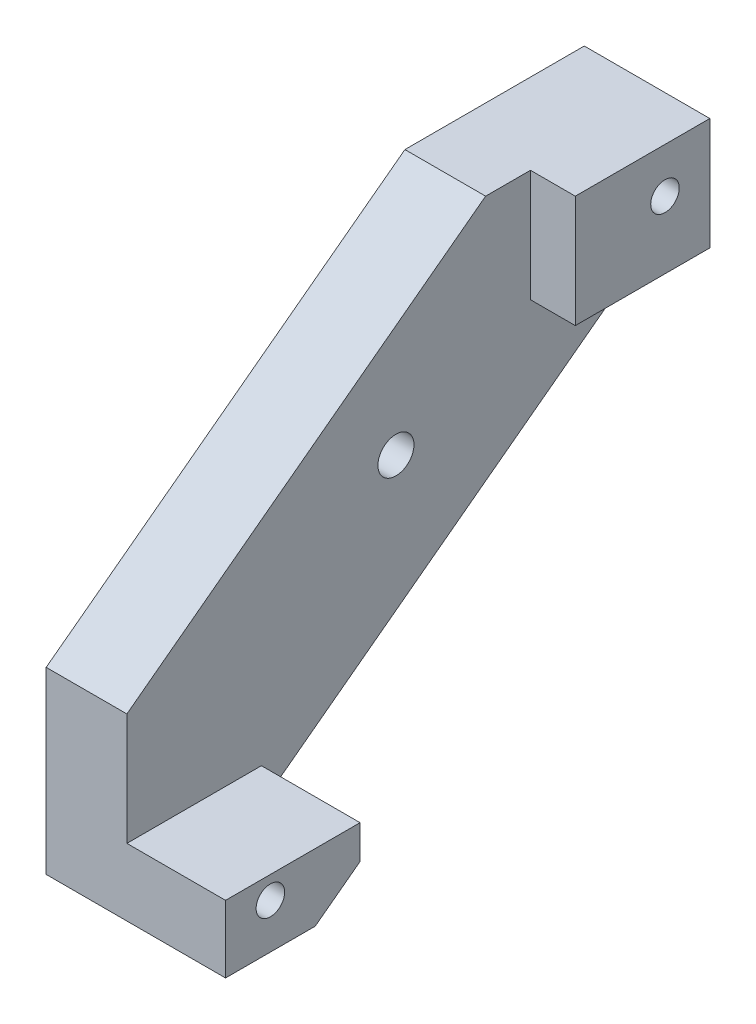
ISO-10303-21;
HEADER;
FILE_DESCRIPTION(('STEP AP214'),'2;1');
FILE_NAME('part.step','',(''),(''),'','','');
FILE_SCHEMA(('AUTOMOTIVE_DESIGN { 1 0 10303 214 1 1 1 1 }'));
ENDSEC;
DATA;
#1=APPLICATION_CONTEXT('core data for automotive mechanical design processes');
#2=APPLICATION_PROTOCOL_DEFINITION('international standard','automotive_design',2000,#1);
#3=PRODUCT_CONTEXT('',#1,'mechanical');
#4=PRODUCT('Part','Part','',(#3));
#5=PRODUCT_RELATED_PRODUCT_CATEGORY('part','',(#4));
#6=PRODUCT_DEFINITION_FORMATION('','',#4);
#7=PRODUCT_DEFINITION_CONTEXT('part definition',#1,'design');
#8=PRODUCT_DEFINITION('design','',#6,#7);
#9=PRODUCT_DEFINITION_SHAPE('','',#8);
#10=(LENGTH_UNIT() NAMED_UNIT(*) SI_UNIT(.MILLI.,.METRE.));
#11=(NAMED_UNIT(*) PLANE_ANGLE_UNIT() SI_UNIT($,.RADIAN.));
#12=(NAMED_UNIT(*) SI_UNIT($,.STERADIAN.) SOLID_ANGLE_UNIT());
#13=UNCERTAINTY_MEASURE_WITH_UNIT(LENGTH_MEASURE(1.E-05),#10,'distance_accuracy_value','');
#14=(GEOMETRIC_REPRESENTATION_CONTEXT(3) GLOBAL_UNCERTAINTY_ASSIGNED_CONTEXT((#13)) GLOBAL_UNIT_ASSIGNED_CONTEXT((#10,
#11,#12)) REPRESENTATION_CONTEXT('',''));
#15=CARTESIAN_POINT('',(0.,0.,0.));
#16=DIRECTION('',(0.,0.,1.));
#17=DIRECTION('',(1.,0.,0.));
#18=AXIS2_PLACEMENT_3D('',#15,#16,#17);
#19=CARTESIAN_POINT('',(25.4,0.,0.));
#20=DIRECTION('',(-1.,0.,0.));
#21=DIRECTION('',(0.,0.,1.));
#22=AXIS2_PLACEMENT_3D('',#19,#20,#21);
#23=PLANE('',#22);
#24=CARTESIAN_POINT('',(25.4,-25.4,31.75));
#25=DIRECTION('',(1.,0.,0.));
#26=DIRECTION('',(0.,0.,-1.));
#27=AXIS2_PLACEMENT_3D('',#24,#25,#26);
#28=CIRCLE('',#27,2.0193);
#29=CARTESIAN_POINT('',(25.4,-25.4,29.7307));
#30=VERTEX_POINT('',#29);
#31=EDGE_CURVE('E163',#30,#30,#28,.T.);
#32=ORIENTED_EDGE('',*,*,#31,.F.);
#33=EDGE_LOOP('',(#32));
#34=FACE_BOUND('',#33,.T.);
#35=DIRECTION('',(0.,-0.6,0.8));
#36=VECTOR('',#35,1.);
#37=CARTESIAN_POINT('',(25.4,15.875,-38.1));
#38=LINE('',#37,#36);
#39=CARTESIAN_POINT('',(25.4,-26.9875,19.05));
#40=VERTEX_POINT('',#39);
#41=CARTESIAN_POINT('',(25.4,-31.75,25.4));
#42=VERTEX_POINT('',#41);
#43=EDGE_CURVE('E236',#40,#42,#38,.T.);
#44=ORIENTED_EDGE('',*,*,#43,.F.);
#45=DIRECTION('',(0.,-1.,0.));
#46=VECTOR('',#45,1.);
#47=CARTESIAN_POINT('',(25.4,-31.75,19.05));
#48=LINE('',#47,#46);
#49=CARTESIAN_POINT('',(25.4,-22.225,19.05));
#50=VERTEX_POINT('',#49);
#51=EDGE_CURVE('E178',#50,#40,#48,.T.);
#52=ORIENTED_EDGE('',*,*,#51,.F.);
#53=DIRECTION('',(0.,0.,-1.));
#54=VECTOR('',#53,1.);
#55=CARTESIAN_POINT('',(25.4,-22.225,38.1));
#56=LINE('',#55,#54);
#57=CARTESIAN_POINT('',(25.4,-22.225,38.1));
#58=VERTEX_POINT('',#57);
#59=EDGE_CURVE('E152',#58,#50,#56,.T.);
#60=ORIENTED_EDGE('',*,*,#59,.F.);
#61=DIRECTION('',(0.,-1.,0.));
#62=VECTOR('',#61,1.);
#63=CARTESIAN_POINT('',(25.4,-31.75,38.1));
#64=LINE('',#63,#62);
#65=CARTESIAN_POINT('',(25.4,-31.75,38.1));
#66=VERTEX_POINT('',#65);
#67=EDGE_CURVE('E193',#58,#66,#64,.T.);
#68=ORIENTED_EDGE('',*,*,#67,.T.);
#69=DIRECTION('',(0.,0.,-1.));
#70=VECTOR('',#69,1.);
#71=CARTESIAN_POINT('',(25.4,-31.75,38.1));
#72=LINE('',#71,#70);
#73=EDGE_CURVE('E195',#66,#42,#72,.T.);
#74=ORIENTED_EDGE('',*,*,#73,.T.);
#75=EDGE_LOOP('',(#44,#52,#60,#68,#74));
#76=FACE_BOUND('',#75,.T.);
#77=ADVANCED_FACE('F39',(#34,#76),#23,.F.);
#78=CARTESIAN_POINT('',(11.43,-31.75,19.05));
#79=DIRECTION('',(0.,0.,1.));
#80=DIRECTION('',(1.,0.,0.));
#81=AXIS2_PLACEMENT_3D('',#78,#79,#80);
#82=PLANE('',#81);
#83=DIRECTION('',(1.,0.,0.));
#84=VECTOR('',#83,1.);
#85=CARTESIAN_POINT('',(11.43,-26.9875,19.05));
#86=LINE('',#85,#84);
#87=CARTESIAN_POINT('',(11.43,-26.9875,19.05));
#88=VERTEX_POINT('',#87);
#89=EDGE_CURVE('E246',#88,#40,#86,.T.);
#90=ORIENTED_EDGE('',*,*,#89,.F.);
#91=DIRECTION('',(0.,-1.,0.));
#92=VECTOR('',#91,1.);
#93=CARTESIAN_POINT('',(11.43,-31.75,19.05));
#94=LINE('',#93,#92);
#95=CARTESIAN_POINT('',(11.43,-22.225,19.05));
#96=VERTEX_POINT('',#95);
#97=EDGE_CURVE('E184',#96,#88,#94,.T.);
#98=ORIENTED_EDGE('',*,*,#97,.F.);
#99=DIRECTION('',(1.,0.,0.));
#100=VECTOR('',#99,1.);
#101=CARTESIAN_POINT('',(11.43,-22.225,19.05));
#102=LINE('',#101,#100);
#103=EDGE_CURVE('E160',#96,#50,#102,.T.);
#104=ORIENTED_EDGE('',*,*,#103,.T.);
#105=ORIENTED_EDGE('',*,*,#51,.T.);
#106=EDGE_LOOP('',(#90,#98,#104,#105));
#107=FACE_BOUND('',#106,.T.);
#108=ADVANCED_FACE('F265',(#107),#82,.F.);
#109=CARTESIAN_POINT('',(25.4,-31.75,-38.1));
#110=DIRECTION('',(0.,0.,1.));
#111=DIRECTION('',(1.,0.,0.));
#112=AXIS2_PLACEMENT_3D('',#109,#110,#111);
#113=PLANE('',#112);
#114=DIRECTION('',(-1.,0.,0.));
#115=VECTOR('',#114,1.);
#116=CARTESIAN_POINT('',(25.4,31.75,-38.1));
#117=LINE('',#116,#115);
#118=CARTESIAN_POINT('',(17.78,31.75,-38.1));
#119=VERTEX_POINT('',#118);
#120=CARTESIAN_POINT('',(0.,31.75,-38.1));
#121=VERTEX_POINT('',#120);
#122=EDGE_CURVE('E140',#119,#121,#117,.T.);
#123=ORIENTED_EDGE('',*,*,#122,.F.);
#124=DIRECTION('',(0.,1.,0.));
#125=VECTOR('',#124,1.);
#126=CARTESIAN_POINT('',(17.78,31.75,-38.1));
#127=LINE('',#126,#125);
#128=CARTESIAN_POINT('',(17.78,15.875,-38.1));
#129=VERTEX_POINT('',#128);
#130=EDGE_CURVE('E129',#129,#119,#127,.T.);
#131=ORIENTED_EDGE('',*,*,#130,.F.);
#132=DIRECTION('',(1.,0.,0.));
#133=VECTOR('',#132,1.);
#134=CARTESIAN_POINT('',(-73.764189942742,15.875,-38.1));
#135=LINE('',#134,#133);
#136=CARTESIAN_POINT('',(11.43,15.875,-38.1));
#137=VERTEX_POINT('',#136);
#138=EDGE_CURVE('E138',#137,#129,#135,.T.);
#139=ORIENTED_EDGE('',*,*,#138,.F.);
#140=DIRECTION('',(-1.,0.,0.));
#141=VECTOR('',#140,1.);
#142=CARTESIAN_POINT('',(25.4,15.875,-38.1));
#143=LINE('',#142,#141);
#144=CARTESIAN_POINT('',(0.,15.875,-38.1));
#145=VERTEX_POINT('',#144);
#146=EDGE_CURVE('E238',#137,#145,#143,.T.);
#147=ORIENTED_EDGE('',*,*,#146,.T.);
#148=DIRECTION('',(0.,1.,0.));
#149=VECTOR('',#148,1.);
#150=CARTESIAN_POINT('',(0.,-31.75,-38.1));
#151=LINE('',#150,#149);
#152=EDGE_CURVE('E192',#145,#121,#151,.T.);
#153=ORIENTED_EDGE('',*,*,#152,.T.);
#154=EDGE_LOOP('',(#123,#131,#139,#147,#153));
#155=FACE_BOUND('',#154,.T.);
#156=ADVANCED_FACE('F41',(#155),#113,.F.);
#157=CARTESIAN_POINT('',(25.4,31.75,38.1));
#158=DIRECTION('',(0.,-1.,0.));
#159=DIRECTION('',(0.,0.,-1.));
#160=AXIS2_PLACEMENT_3D('',#157,#158,#159);
#161=PLANE('',#160);
#162=DIRECTION('',(1.,0.,0.));
#163=VECTOR('',#162,1.);
#164=CARTESIAN_POINT('',(11.43,31.75,-19.05));
#165=LINE('',#164,#163);
#166=CARTESIAN_POINT('',(11.43,31.75,-19.05));
#167=VERTEX_POINT('',#166);
#168=CARTESIAN_POINT('',(17.78,31.75,-19.05));
#169=VERTEX_POINT('',#168);
#170=EDGE_CURVE('E187',#167,#169,#165,.T.);
#171=ORIENTED_EDGE('',*,*,#170,.T.);
#172=DIRECTION('',(0.,0.,-1.));
#173=VECTOR('',#172,1.);
#174=CARTESIAN_POINT('',(17.78,31.75,38.1));
#175=LINE('',#174,#173);
#176=EDGE_CURVE('E141',#169,#119,#175,.T.);
#177=ORIENTED_EDGE('',*,*,#176,.T.);
#178=ORIENTED_EDGE('',*,*,#122,.T.);
#179=DIRECTION('',(0.,0.,1.));
#180=VECTOR('',#179,1.);
#181=CARTESIAN_POINT('',(0.,31.75,38.1));
#182=LINE('',#181,#180);
#183=CARTESIAN_POINT('',(0.,31.75,-12.7));
#184=VERTEX_POINT('',#183);
#185=EDGE_CURVE('E201',#121,#184,#182,.T.);
#186=ORIENTED_EDGE('',*,*,#185,.T.);
#187=DIRECTION('',(-1.,0.,0.));
#188=VECTOR('',#187,1.);
#189=CARTESIAN_POINT('',(25.4,31.75,-12.7));
#190=LINE('',#189,#188);
#191=CARTESIAN_POINT('',(11.43,31.75,-12.7));
#192=VERTEX_POINT('',#191);
#193=EDGE_CURVE('E212',#192,#184,#190,.T.);
#194=ORIENTED_EDGE('',*,*,#193,.F.);
#195=DIRECTION('',(0.,0.,1.));
#196=VECTOR('',#195,1.);
#197=CARTESIAN_POINT('',(11.43,31.75,19.05));
#198=LINE('',#197,#196);
#199=EDGE_CURVE('E181',#167,#192,#198,.T.);
#200=ORIENTED_EDGE('',*,*,#199,.F.);
#201=EDGE_LOOP('',(#171,#177,#178,#186,#194,#200));
#202=FACE_BOUND('',#201,.T.);
#203=ADVANCED_FACE('F218',(#202),#161,.F.);
#204=CARTESIAN_POINT('',(25.4,-31.75,38.1));
#205=DIRECTION('',(0.,0.,-1.));
#206=DIRECTION('',(-1.,0.,0.));
#207=AXIS2_PLACEMENT_3D('',#204,#205,#206);
#208=PLANE('',#207);
#209=DIRECTION('',(1.,0.,0.));
#210=VECTOR('',#209,1.);
#211=CARTESIAN_POINT('',(25.4,-6.34999999999999,38.1));
#212=LINE('',#211,#210);
#213=CARTESIAN_POINT('',(0.,-6.34999999999999,38.1));
#214=VERTEX_POINT('',#213);
#215=CARTESIAN_POINT('',(11.43,-6.34999999999999,38.1));
#216=VERTEX_POINT('',#215);
#217=EDGE_CURVE('E61',#214,#216,#212,.T.);
#218=ORIENTED_EDGE('',*,*,#217,.F.);
#219=DIRECTION('',(0.,-1.,0.));
#220=VECTOR('',#219,1.);
#221=CARTESIAN_POINT('',(0.,-31.75,38.1));
#222=LINE('',#221,#220);
#223=CARTESIAN_POINT('',(0.,-31.75,38.1));
#224=VERTEX_POINT('',#223);
#225=EDGE_CURVE('E204',#214,#224,#222,.T.);
#226=ORIENTED_EDGE('',*,*,#225,.T.);
#227=DIRECTION('',(-1.,0.,0.));
#228=VECTOR('',#227,1.);
#229=CARTESIAN_POINT('',(25.4,-31.75,38.1));
#230=LINE('',#229,#228);
#231=EDGE_CURVE('E199',#66,#224,#230,.T.);
#232=ORIENTED_EDGE('',*,*,#231,.F.);
#233=ORIENTED_EDGE('',*,*,#67,.F.);
#234=DIRECTION('',(1.,0.,0.));
#235=VECTOR('',#234,1.);
#236=CARTESIAN_POINT('',(-73.764189942742,-22.225,38.1));
#237=LINE('',#236,#235);
#238=CARTESIAN_POINT('',(11.43,-22.225,38.1));
#239=VERTEX_POINT('',#238);
#240=EDGE_CURVE('E156',#239,#58,#237,.T.);
#241=ORIENTED_EDGE('',*,*,#240,.F.);
#242=DIRECTION('',(0.,-1.,0.));
#243=VECTOR('',#242,1.);
#244=CARTESIAN_POINT('',(11.43,15.875,38.1));
#245=LINE('',#244,#243);
#246=EDGE_CURVE('E149',#216,#239,#245,.T.);
#247=ORIENTED_EDGE('',*,*,#246,.F.);
#248=EDGE_LOOP('',(#218,#226,#232,#233,#241,#247));
#249=FACE_BOUND('',#248,.T.);
#250=ADVANCED_FACE('F257',(#249),#208,.F.);
#251=CARTESIAN_POINT('',(25.4,-31.75,38.1));
#252=DIRECTION('',(0.,1.,0.));
#253=DIRECTION('',(0.,0.,1.));
#254=AXIS2_PLACEMENT_3D('',#251,#252,#253);
#255=PLANE('',#254);
#256=DIRECTION('',(-1.,0.,0.));
#257=VECTOR('',#256,1.);
#258=CARTESIAN_POINT('',(25.4,-31.75,25.4));
#259=LINE('',#258,#257);
#260=CARTESIAN_POINT('',(0.,-31.75,25.4));
#261=VERTEX_POINT('',#260);
#262=EDGE_CURVE('E221',#42,#261,#259,.T.);
#263=ORIENTED_EDGE('',*,*,#262,.F.);
#264=ORIENTED_EDGE('',*,*,#73,.F.);
#265=ORIENTED_EDGE('',*,*,#231,.T.);
#266=DIRECTION('',(0.,0.,-1.));
#267=VECTOR('',#266,1.);
#268=CARTESIAN_POINT('',(0.,-31.75,38.1));
#269=LINE('',#268,#267);
#270=EDGE_CURVE('E196',#224,#261,#269,.T.);
#271=ORIENTED_EDGE('',*,*,#270,.T.);
#272=EDGE_LOOP('',(#263,#264,#265,#271));
#273=FACE_BOUND('',#272,.T.);
#274=ADVANCED_FACE('F275',(#273),#255,.F.);
#275=CARTESIAN_POINT('',(0.,0.,0.));
#276=DIRECTION('',(-1.,0.,0.));
#277=DIRECTION('',(0.,0.,1.));
#278=AXIS2_PLACEMENT_3D('',#275,#276,#277);
#279=PLANE('',#278);
#280=CARTESIAN_POINT('',(0.,6.35,0.));
#281=DIRECTION('',(-1.,0.,0.));
#282=DIRECTION('',(0.,0.,1.));
#283=AXIS2_PLACEMENT_3D('',#280,#281,#282);
#284=CIRCLE('',#283,2.55269999999999);
#285=CARTESIAN_POINT('',(0.,6.35,2.55269999999999));
#286=VERTEX_POINT('',#285);
#287=EDGE_CURVE('E175',#286,#286,#284,.T.);
#288=ORIENTED_EDGE('',*,*,#287,.F.);
#289=EDGE_LOOP('',(#288));
#290=FACE_BOUND('',#289,.T.);
#291=ORIENTED_EDGE('',*,*,#225,.F.);
#292=DIRECTION('',(0.,0.6,-0.8));
#293=VECTOR('',#292,1.);
#294=CARTESIAN_POINT('',(0.,-7.26439999999999,39.3192));
#295=LINE('',#294,#293);
#296=EDGE_CURVE('E239',#214,#184,#295,.T.);
#297=ORIENTED_EDGE('',*,*,#296,.T.);
#298=ORIENTED_EDGE('',*,*,#185,.F.);
#299=ORIENTED_EDGE('',*,*,#152,.F.);
#300=DIRECTION('',(0.,-0.6,0.8));
#301=VECTOR('',#300,1.);
#302=CARTESIAN_POINT('',(0.,15.875,-38.1));
#303=LINE('',#302,#301);
#304=EDGE_CURVE('E235',#145,#261,#303,.T.);
#305=ORIENTED_EDGE('',*,*,#304,.T.);
#306=ORIENTED_EDGE('',*,*,#270,.F.);
#307=EDGE_LOOP('',(#291,#297,#298,#299,#305,#306));
#308=FACE_BOUND('',#307,.T.);
#309=ADVANCED_FACE('F271',(#290,#308),#279,.T.);
#310=CARTESIAN_POINT('',(11.43,0.,0.));
#311=DIRECTION('',(-1.,0.,0.));
#312=DIRECTION('',(0.,0.,1.));
#313=AXIS2_PLACEMENT_3D('',#310,#311,#312);
#314=PLANE('',#313);
#315=CARTESIAN_POINT('',(11.43,6.35,0.));
#316=DIRECTION('',(1.,0.,0.));
#317=DIRECTION('',(0.,0.,-1.));
#318=AXIS2_PLACEMENT_3D('',#315,#316,#317);
#319=CIRCLE('',#318,2.55269999999999);
#320=CARTESIAN_POINT('',(11.43,6.35,-2.55269999999999));
#321=VERTEX_POINT('',#320);
#322=EDGE_CURVE('E172',#321,#321,#319,.T.);
#323=ORIENTED_EDGE('',*,*,#322,.F.);
#324=EDGE_LOOP('',(#323));
#325=FACE_BOUND('',#324,.T.);
#326=DIRECTION('',(0.,0.6,-0.8));
#327=VECTOR('',#326,1.);
#328=CARTESIAN_POINT('',(11.43,14.224,10.668));
#329=LINE('',#328,#327);
#330=EDGE_CURVE('E47',#216,#192,#329,.T.);
#331=ORIENTED_EDGE('',*,*,#330,.F.);
#332=ORIENTED_EDGE('',*,*,#246,.T.);
#333=DIRECTION('',(0.,0.,-1.));
#334=VECTOR('',#333,1.);
#335=CARTESIAN_POINT('',(11.43,-22.225,38.1));
#336=LINE('',#335,#334);
#337=EDGE_CURVE('E147',#239,#96,#336,.T.);
#338=ORIENTED_EDGE('',*,*,#337,.T.);
#339=ORIENTED_EDGE('',*,*,#97,.T.);
#340=DIRECTION('',(0.,-0.6,0.8));
#341=VECTOR('',#340,1.);
#342=CARTESIAN_POINT('',(11.43,-8.128,-6.096));
#343=LINE('',#342,#341);
#344=EDGE_CURVE('E220',#137,#88,#343,.T.);
#345=ORIENTED_EDGE('',*,*,#344,.F.);
#346=DIRECTION('',(0.,0.,1.));
#347=VECTOR('',#346,1.);
#348=CARTESIAN_POINT('',(11.43,15.875,38.1));
#349=LINE('',#348,#347);
#350=CARTESIAN_POINT('',(11.43,15.875,-19.05));
#351=VERTEX_POINT('',#350);
#352=EDGE_CURVE('E146',#137,#351,#349,.T.);
#353=ORIENTED_EDGE('',*,*,#352,.T.);
#354=DIRECTION('',(0.,1.,0.));
#355=VECTOR('',#354,1.);
#356=CARTESIAN_POINT('',(11.43,-31.75,-19.05));
#357=LINE('',#356,#355);
#358=EDGE_CURVE('E179',#351,#167,#357,.T.);
#359=ORIENTED_EDGE('',*,*,#358,.T.);
#360=ORIENTED_EDGE('',*,*,#199,.T.);
#361=EDGE_LOOP('',(#331,#332,#338,#339,#345,#353,#359,#360));
#362=FACE_BOUND('',#361,.T.);
#363=ADVANCED_FACE('F223',(#325,#362),#314,.F.);
#364=CARTESIAN_POINT('',(11.43,-31.75,-19.05));
#365=DIRECTION('',(0.,0.,-1.));
#366=DIRECTION('',(-1.,0.,0.));
#367=AXIS2_PLACEMENT_3D('',#364,#365,#366);
#368=PLANE('',#367);
#369=DIRECTION('',(1.,0.,0.));
#370=VECTOR('',#369,1.);
#371=CARTESIAN_POINT('',(11.43,15.875,-19.05));
#372=LINE('',#371,#370);
#373=CARTESIAN_POINT('',(17.78,15.875,-19.05));
#374=VERTEX_POINT('',#373);
#375=EDGE_CURVE('E158',#351,#374,#372,.T.);
#376=ORIENTED_EDGE('',*,*,#375,.T.);
#377=DIRECTION('',(0.,1.,0.));
#378=VECTOR('',#377,1.);
#379=CARTESIAN_POINT('',(17.78,-31.75,-19.05));
#380=LINE('',#379,#378);
#381=EDGE_CURVE('E54',#374,#169,#380,.T.);
#382=ORIENTED_EDGE('',*,*,#381,.T.);
#383=ORIENTED_EDGE('',*,*,#170,.F.);
#384=ORIENTED_EDGE('',*,*,#358,.F.);
#385=EDGE_LOOP('',(#376,#382,#383,#384));
#386=FACE_BOUND('',#385,.T.);
#387=ADVANCED_FACE('F228',(#386),#368,.F.);
#388=CARTESIAN_POINT('',(11.43,6.35,0.));
#389=DIRECTION('',(1.,0.,0.));
#390=DIRECTION('',(0.,0.,-1.));
#391=AXIS2_PLACEMENT_3D('',#388,#389,#390);
#392=CYLINDRICAL_SURFACE('',#391,2.55269999999999);
#393=ORIENTED_EDGE('',*,*,#287,.T.);
#394=EDGE_LOOP('',(#393));
#395=FACE_BOUND('',#394,.T.);
#396=ORIENTED_EDGE('',*,*,#322,.T.);
#397=EDGE_LOOP('',(#396));
#398=FACE_BOUND('',#397,.T.);
#399=ADVANCED_FACE('F295',(#395,#398),#392,.F.);
#400=CARTESIAN_POINT('',(11.684,-25.4,31.75));
#401=DIRECTION('',(1.,0.,0.));
#402=DIRECTION('',(0.,0.,-1.));
#403=AXIS2_PLACEMENT_3D('',#400,#401,#402);
#404=CONICAL_SURFACE('',#403,2.01929999999999,1.02974425867665);
#405=CARTESIAN_POINT('',(10.4706821519976,-25.4,31.75));
#406=VERTEX_POINT('',#405);
#407=VERTEX_LOOP('',#406);
#408=FACE_BOUND('',#407,.T.);
#409=CARTESIAN_POINT('',(11.684,-25.4,31.75));
#410=DIRECTION('',(1.,0.,0.));
#411=DIRECTION('',(0.,0.,-1.));
#412=AXIS2_PLACEMENT_3D('',#409,#410,#411);
#413=CIRCLE('',#412,2.01929999999999);
#414=CARTESIAN_POINT('',(11.684,-25.4,29.7307));
#415=VERTEX_POINT('',#414);
#416=EDGE_CURVE('E166',#415,#415,#413,.T.);
#417=ORIENTED_EDGE('',*,*,#416,.T.);
#418=EDGE_LOOP('',(#417));
#419=FACE_BOUND('',#418,.T.);
#420=ADVANCED_FACE('F302',(#408,#419),#404,.F.);
#421=CARTESIAN_POINT('',(25.4,-25.4,31.75));
#422=DIRECTION('',(1.,0.,0.));
#423=DIRECTION('',(0.,0.,-1.));
#424=AXIS2_PLACEMENT_3D('',#421,#422,#423);
#425=CYLINDRICAL_SURFACE('',#424,2.0193);
#426=ORIENTED_EDGE('',*,*,#416,.F.);
#427=EDGE_LOOP('',(#426));
#428=FACE_BOUND('',#427,.T.);
#429=ORIENTED_EDGE('',*,*,#31,.T.);
#430=EDGE_LOOP('',(#429));
#431=FACE_BOUND('',#430,.T.);
#432=ADVANCED_FACE('F314',(#428,#431),#425,.F.);
#433=CARTESIAN_POINT('',(-73.764189942742,-22.225,38.1));
#434=DIRECTION('',(0.,-1.,0.));
#435=DIRECTION('',(0.,0.,-1.));
#436=AXIS2_PLACEMENT_3D('',#433,#434,#435);
#437=PLANE('',#436);
#438=ORIENTED_EDGE('',*,*,#337,.F.);
#439=ORIENTED_EDGE('',*,*,#240,.T.);
#440=ORIENTED_EDGE('',*,*,#59,.T.);
#441=ORIENTED_EDGE('',*,*,#103,.F.);
#442=EDGE_LOOP('',(#438,#439,#440,#441));
#443=FACE_BOUND('',#442,.T.);
#444=ADVANCED_FACE('F254',(#443),#437,.F.);
#445=CARTESIAN_POINT('',(-73.764189942742,15.875,38.1));
#446=DIRECTION('',(0.,1.,0.));
#447=DIRECTION('',(0.,0.,1.));
#448=AXIS2_PLACEMENT_3D('',#445,#446,#447);
#449=PLANE('',#448);
#450=ORIENTED_EDGE('',*,*,#138,.T.);
#451=DIRECTION('',(0.,0.,1.));
#452=VECTOR('',#451,1.);
#453=CARTESIAN_POINT('',(17.78,15.875,38.1));
#454=LINE('',#453,#452);
#455=EDGE_CURVE('E12',#129,#374,#454,.T.);
#456=ORIENTED_EDGE('',*,*,#455,.T.);
#457=ORIENTED_EDGE('',*,*,#375,.F.);
#458=ORIENTED_EDGE('',*,*,#352,.F.);
#459=EDGE_LOOP('',(#450,#456,#457,#458));
#460=FACE_BOUND('',#459,.T.);
#461=ADVANCED_FACE('F144',(#460),#449,.F.);
#462=CARTESIAN_POINT('',(25.4,15.875,-38.1));
#463=DIRECTION('',(0.,-0.8,-0.6));
#464=DIRECTION('',(0.,0.6,-0.8));
#465=AXIS2_PLACEMENT_3D('',#462,#463,#464);
#466=PLANE('',#465);
#467=ORIENTED_EDGE('',*,*,#89,.T.);
#468=ORIENTED_EDGE('',*,*,#43,.T.);
#469=ORIENTED_EDGE('',*,*,#262,.T.);
#470=ORIENTED_EDGE('',*,*,#304,.F.);
#471=ORIENTED_EDGE('',*,*,#146,.F.);
#472=ORIENTED_EDGE('',*,*,#344,.T.);
#473=EDGE_LOOP('',(#467,#468,#469,#470,#471,#472));
#474=FACE_BOUND('',#473,.T.);
#475=ADVANCED_FACE('F267',(#474),#466,.T.);
#476=CARTESIAN_POINT('',(25.4,-7.26439999999999,39.3192));
#477=DIRECTION('',(0.,0.8,0.6));
#478=DIRECTION('',(0.,-0.6,0.8));
#479=AXIS2_PLACEMENT_3D('',#476,#477,#478);
#480=PLANE('',#479);
#481=ORIENTED_EDGE('',*,*,#217,.T.);
#482=ORIENTED_EDGE('',*,*,#330,.T.);
#483=ORIENTED_EDGE('',*,*,#193,.T.);
#484=ORIENTED_EDGE('',*,*,#296,.F.);
#485=EDGE_LOOP('',(#481,#482,#483,#484));
#486=FACE_BOUND('',#485,.T.);
#487=ADVANCED_FACE('F211',(#486),#480,.T.);
#488=CARTESIAN_POINT('',(17.78,31.75,38.1));
#489=DIRECTION('',(-1.,0.,0.));
#490=DIRECTION('',(0.,-1.,0.));
#491=AXIS2_PLACEMENT_3D('',#488,#489,#490);
#492=PLANE('',#491);
#493=CARTESIAN_POINT('',(17.78,25.4,-31.75));
#494=DIRECTION('',(-1.,0.,0.));
#495=DIRECTION('',(0.,-1.,0.));
#496=AXIS2_PLACEMENT_3D('',#493,#494,#495);
#497=CIRCLE('',#496,2.0193);
#498=CARTESIAN_POINT('',(17.78,23.3807,-31.75));
#499=VERTEX_POINT('',#498);
#500=EDGE_CURVE('E229',#499,#499,#497,.F.);
#501=ORIENTED_EDGE('',*,*,#500,.F.);
#502=EDGE_LOOP('',(#501));
#503=FACE_BOUND('',#502,.T.);
#504=ORIENTED_EDGE('',*,*,#455,.F.);
#505=ORIENTED_EDGE('',*,*,#130,.T.);
#506=ORIENTED_EDGE('',*,*,#176,.F.);
#507=ORIENTED_EDGE('',*,*,#381,.F.);
#508=EDGE_LOOP('',(#504,#505,#506,#507));
#509=FACE_BOUND('',#508,.T.);
#510=ADVANCED_FACE('F128',(#503,#509),#492,.F.);
#511=CARTESIAN_POINT('',(11.684,25.4,-31.75));
#512=DIRECTION('',(1.,0.,0.));
#513=DIRECTION('',(0.,0.,-1.));
#514=AXIS2_PLACEMENT_3D('',#511,#512,#513);
#515=CONICAL_SURFACE('',#514,2.01929999999999,1.02974425867665);
#516=CARTESIAN_POINT('',(10.4706821519976,25.4,-31.75));
#517=VERTEX_POINT('',#516);
#518=VERTEX_LOOP('',#517);
#519=FACE_BOUND('',#518,.T.);
#520=CARTESIAN_POINT('',(11.684,25.4,-31.75));
#521=DIRECTION('',(1.,0.,0.));
#522=DIRECTION('',(0.,0.,-1.));
#523=AXIS2_PLACEMENT_3D('',#520,#521,#522);
#524=CIRCLE('',#523,2.01929999999999);
#525=CARTESIAN_POINT('',(11.684,25.4,-33.7693));
#526=VERTEX_POINT('',#525);
#527=EDGE_CURVE('E169',#526,#526,#524,.T.);
#528=ORIENTED_EDGE('',*,*,#527,.T.);
#529=EDGE_LOOP('',(#528));
#530=FACE_BOUND('',#529,.T.);
#531=ADVANCED_FACE('F304',(#519,#530),#515,.F.);
#532=CARTESIAN_POINT('',(25.4,25.4,-31.75));
#533=DIRECTION('',(1.,0.,0.));
#534=DIRECTION('',(0.,0.,-1.));
#535=AXIS2_PLACEMENT_3D('',#532,#533,#534);
#536=CYLINDRICAL_SURFACE('',#535,2.0193);
#537=ORIENTED_EDGE('',*,*,#500,.T.);
#538=EDGE_LOOP('',(#537));
#539=FACE_BOUND('',#538,.T.);
#540=ORIENTED_EDGE('',*,*,#527,.F.);
#541=EDGE_LOOP('',(#540));
#542=FACE_BOUND('',#541,.T.);
#543=ADVANCED_FACE('F307',(#539,#542),#536,.F.);
#544=CLOSED_SHELL('',(#77,#108,#156,#203,#250,#274,#309,#363,#387,#399,#420,#432,#444,#461,#475,
#487,#510,#531,#543));
#545=MANIFOLD_SOLID_BREP('B2',#544);
#546=ADVANCED_BREP_SHAPE_REPRESENTATION('',(#18,#545),#14);
#547=SHAPE_DEFINITION_REPRESENTATION(#9,#546);
ENDSEC;
END-ISO-10303-21;
